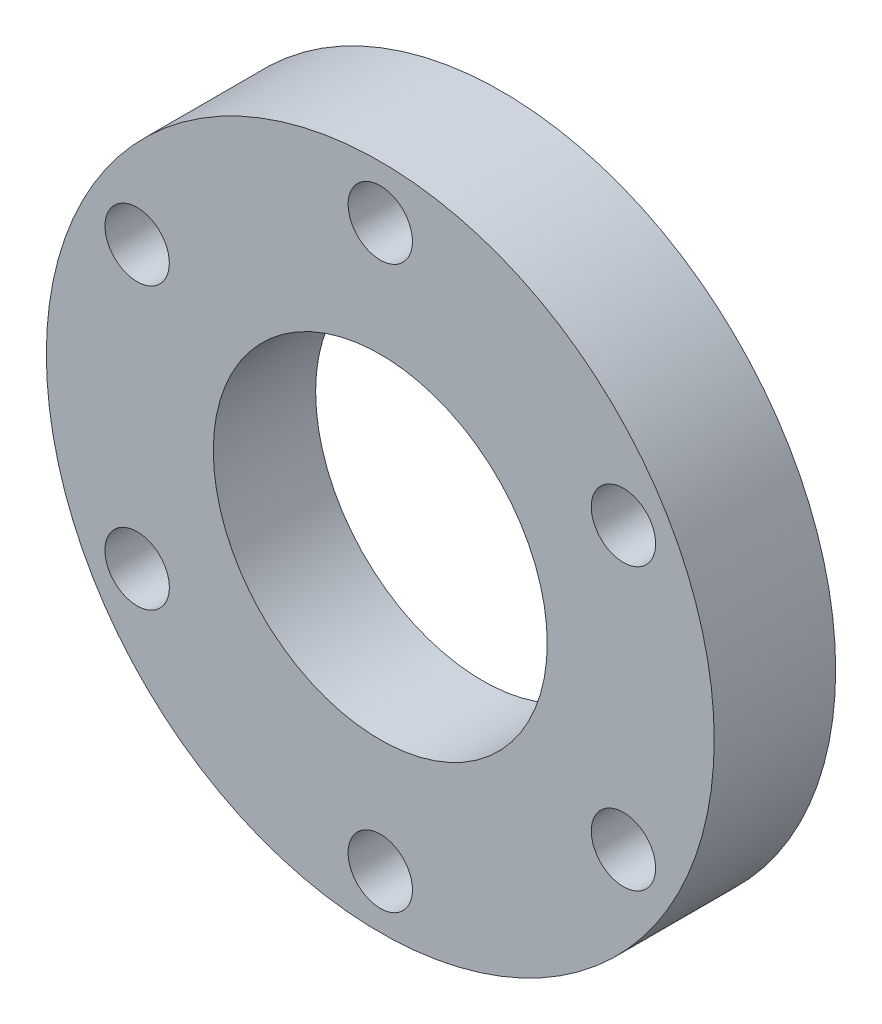
ISO-10303-21;
HEADER;
FILE_DESCRIPTION(('STEP AP214'),'2;1');
FILE_NAME('part.step','',(''),(''),'','','');
FILE_SCHEMA(('AUTOMOTIVE_DESIGN { 1 0 10303 214 1 1 1 1 }'));
ENDSEC;
DATA;
#1=APPLICATION_CONTEXT('core data for automotive mechanical design processes');
#2=APPLICATION_PROTOCOL_DEFINITION('international standard','automotive_design',2000,#1);
#3=PRODUCT_CONTEXT('',#1,'mechanical');
#4=PRODUCT('Part','Part','',(#3));
#5=PRODUCT_RELATED_PRODUCT_CATEGORY('part','',(#4));
#6=PRODUCT_DEFINITION_FORMATION('','',#4);
#7=PRODUCT_DEFINITION_CONTEXT('part definition',#1,'design');
#8=PRODUCT_DEFINITION('design','',#6,#7);
#9=PRODUCT_DEFINITION_SHAPE('','',#8);
#10=(LENGTH_UNIT() NAMED_UNIT(*) SI_UNIT(.MILLI.,.METRE.));
#11=(NAMED_UNIT(*) PLANE_ANGLE_UNIT() SI_UNIT($,.RADIAN.));
#12=(NAMED_UNIT(*) SI_UNIT($,.STERADIAN.) SOLID_ANGLE_UNIT());
#13=UNCERTAINTY_MEASURE_WITH_UNIT(LENGTH_MEASURE(1.E-05),#10,'distance_accuracy_value','');
#14=(GEOMETRIC_REPRESENTATION_CONTEXT(3) GLOBAL_UNCERTAINTY_ASSIGNED_CONTEXT((#13)) GLOBAL_UNIT_ASSIGNED_CONTEXT((#10,
#11,#12)) REPRESENTATION_CONTEXT('',''));
#15=CARTESIAN_POINT('',(0.,0.,0.));
#16=DIRECTION('',(0.,0.,1.));
#17=DIRECTION('',(1.,0.,0.));
#18=AXIS2_PLACEMENT_3D('',#15,#16,#17);
#19=CARTESIAN_POINT('',(0.,0.,12.7));
#20=DIRECTION('',(0.,0.,1.));
#21=DIRECTION('',(1.,0.,0.));
#22=AXIS2_PLACEMENT_3D('',#19,#20,#21);
#23=PLANE('',#22);
#24=CARTESIAN_POINT('',(0.,0.,12.7));
#25=DIRECTION('',(0.,0.,1.));
#26=DIRECTION('',(1.,0.,0.));
#27=AXIS2_PLACEMENT_3D('',#24,#25,#26);
#28=CIRCLE('',#27,17.4625);
#29=CARTESIAN_POINT('',(17.4625,0.,12.7));
#30=VERTEX_POINT('',#29);
#31=EDGE_CURVE('E88',#30,#30,#28,.T.);
#32=ORIENTED_EDGE('',*,*,#31,.F.);
#33=EDGE_LOOP('',(#32));
#34=FACE_BOUND('',#33,.T.);
#35=CARTESIAN_POINT('',(-25.42858431608,14.6812000000003,12.7));
#36=DIRECTION('',(0.,0.,-1.));
#37=DIRECTION('',(-0.50000000000001,-0.866025403784433,0.));
#38=AXIS2_PLACEMENT_3D('',#35,#36,#37);
#39=CIRCLE('',#38,3.3655);
#40=CARTESIAN_POINT('',(-27.1113343160801,11.7665915035638,12.7));
#41=VERTEX_POINT('',#40);
#42=EDGE_CURVE('E76',#41,#41,#39,.T.);
#43=ORIENTED_EDGE('',*,*,#42,.T.);
#44=EDGE_LOOP('',(#43));
#45=FACE_BOUND('',#44,.T.);
#46=CARTESIAN_POINT('',(-25.4285843160803,-14.6811999999998,12.7));
#47=DIRECTION('',(0.,0.,-1.));
#48=DIRECTION('',(0.499999999999992,-0.866025403784443,0.));
#49=AXIS2_PLACEMENT_3D('',#46,#47,#48);
#50=CIRCLE('',#49,3.3655);
#51=CARTESIAN_POINT('',(-23.7458343160804,-17.5958084964363,12.7));
#52=VERTEX_POINT('',#51);
#53=EDGE_CURVE('E70',#52,#52,#50,.T.);
#54=ORIENTED_EDGE('',*,*,#53,.T.);
#55=EDGE_LOOP('',(#54));
#56=FACE_BOUND('',#55,.T.);
#57=CARTESIAN_POINT('',(-2.05036662084476E-13,-29.3624,12.7));
#58=DIRECTION('',(0.,0.,-1.));
#59=DIRECTION('',(1.,0.,0.));
#60=AXIS2_PLACEMENT_3D('',#57,#58,#59);
#61=CIRCLE('',#60,3.3655);
#62=CARTESIAN_POINT('',(3.36549999999979,-29.3624,12.7));
#63=VERTEX_POINT('',#62);
#64=EDGE_CURVE('E64',#63,#63,#61,.T.);
#65=ORIENTED_EDGE('',*,*,#64,.T.);
#66=EDGE_LOOP('',(#65));
#67=FACE_BOUND('',#66,.T.);
#68=CARTESIAN_POINT('',(25.4285843160801,-14.6812000000001,12.7));
#69=DIRECTION('',(0.,0.,-1.));
#70=DIRECTION('',(0.500000000000004,0.866025403784436,0.));
#71=AXIS2_PLACEMENT_3D('',#68,#69,#70);
#72=CIRCLE('',#71,3.3655);
#73=CARTESIAN_POINT('',(27.1113343160802,-11.7665915035636,12.7));
#74=VERTEX_POINT('',#73);
#75=EDGE_CURVE('E58',#74,#74,#72,.T.);
#76=ORIENTED_EDGE('',*,*,#75,.T.);
#77=EDGE_LOOP('',(#76));
#78=FACE_BOUND('',#77,.T.);
#79=CARTESIAN_POINT('',(25.4285843160802,14.6811999999999,12.7));
#80=DIRECTION('',(0.,0.,-1.));
#81=DIRECTION('',(-0.499999999999998,0.86602540378444,0.));
#82=AXIS2_PLACEMENT_3D('',#79,#80,#81);
#83=CIRCLE('',#82,3.3655);
#84=CARTESIAN_POINT('',(23.7458343160802,17.5958084964365,12.7));
#85=VERTEX_POINT('',#84);
#86=EDGE_CURVE('E52',#85,#85,#83,.T.);
#87=ORIENTED_EDGE('',*,*,#86,.T.);
#88=EDGE_LOOP('',(#87));
#89=FACE_BOUND('',#88,.T.);
#90=CARTESIAN_POINT('',(0.,29.3624,12.7));
#91=DIRECTION('',(0.,0.,-1.));
#92=DIRECTION('',(-1.,0.,0.));
#93=AXIS2_PLACEMENT_3D('',#90,#91,#92);
#94=CIRCLE('',#93,3.3655);
#95=CARTESIAN_POINT('',(-3.3655,29.3624,12.7));
#96=VERTEX_POINT('',#95);
#97=EDGE_CURVE('E44',#96,#96,#94,.T.);
#98=ORIENTED_EDGE('',*,*,#97,.T.);
#99=EDGE_LOOP('',(#98));
#100=FACE_BOUND('',#99,.T.);
#101=CARTESIAN_POINT('',(0.,0.,12.7));
#102=DIRECTION('',(0.,0.,1.));
#103=DIRECTION('',(1.,0.,0.));
#104=AXIS2_PLACEMENT_3D('',#101,#102,#103);
#105=CIRCLE('',#104,34.925);
#106=CARTESIAN_POINT('',(34.925,0.,12.7));
#107=VERTEX_POINT('',#106);
#108=EDGE_CURVE('E10',#107,#107,#105,.T.);
#109=ORIENTED_EDGE('',*,*,#108,.T.);
#110=EDGE_LOOP('',(#109));
#111=FACE_BOUND('',#110,.T.);
#112=ADVANCED_FACE('F32',(#34,#45,#56,#67,#78,#89,#100,#111),#23,.T.);
#113=CARTESIAN_POINT('',(0.,0.,0.));
#114=DIRECTION('',(0.,0.,1.));
#115=DIRECTION('',(1.,0.,0.));
#116=AXIS2_PLACEMENT_3D('',#113,#114,#115);
#117=PLANE('',#116);
#118=CARTESIAN_POINT('',(0.,0.,0.));
#119=DIRECTION('',(0.,0.,-1.));
#120=DIRECTION('',(-1.,0.,0.));
#121=AXIS2_PLACEMENT_3D('',#118,#119,#120);
#122=CIRCLE('',#121,23.0712483703385);
#123=CARTESIAN_POINT('',(-23.0712483703385,0.,0.));
#124=VERTEX_POINT('',#123);
#125=EDGE_CURVE('E85',#124,#124,#122,.T.);
#126=ORIENTED_EDGE('',*,*,#125,.F.);
#127=EDGE_LOOP('',(#126));
#128=FACE_BOUND('',#127,.T.);
#129=CARTESIAN_POINT('',(-25.42858431608,14.6812000000003,0.));
#130=DIRECTION('',(0.,0.,-1.));
#131=DIRECTION('',(-0.50000000000001,-0.866025403784433,0.));
#132=AXIS2_PLACEMENT_3D('',#129,#130,#131);
#133=CIRCLE('',#132,3.3655);
#134=CARTESIAN_POINT('',(-27.1113343160801,11.7665915035638,0.));
#135=VERTEX_POINT('',#134);
#136=EDGE_CURVE('E79',#135,#135,#133,.T.);
#137=ORIENTED_EDGE('',*,*,#136,.F.);
#138=EDGE_LOOP('',(#137));
#139=FACE_BOUND('',#138,.T.);
#140=CARTESIAN_POINT('',(-25.4285843160803,-14.6811999999998,0.));
#141=DIRECTION('',(0.,0.,-1.));
#142=DIRECTION('',(0.499999999999992,-0.866025403784443,0.));
#143=AXIS2_PLACEMENT_3D('',#140,#141,#142);
#144=CIRCLE('',#143,3.3655);
#145=CARTESIAN_POINT('',(-23.7458343160804,-17.5958084964363,0.));
#146=VERTEX_POINT('',#145);
#147=EDGE_CURVE('E73',#146,#146,#144,.T.);
#148=ORIENTED_EDGE('',*,*,#147,.F.);
#149=EDGE_LOOP('',(#148));
#150=FACE_BOUND('',#149,.T.);
#151=CARTESIAN_POINT('',(-2.05036662084476E-13,-29.3624,0.));
#152=DIRECTION('',(0.,0.,-1.));
#153=DIRECTION('',(1.,0.,0.));
#154=AXIS2_PLACEMENT_3D('',#151,#152,#153);
#155=CIRCLE('',#154,3.3655);
#156=CARTESIAN_POINT('',(3.36549999999979,-29.3624,0.));
#157=VERTEX_POINT('',#156);
#158=EDGE_CURVE('E67',#157,#157,#155,.T.);
#159=ORIENTED_EDGE('',*,*,#158,.F.);
#160=EDGE_LOOP('',(#159));
#161=FACE_BOUND('',#160,.T.);
#162=CARTESIAN_POINT('',(25.4285843160801,-14.6812000000001,0.));
#163=DIRECTION('',(0.,0.,-1.));
#164=DIRECTION('',(0.500000000000004,0.866025403784436,0.));
#165=AXIS2_PLACEMENT_3D('',#162,#163,#164);
#166=CIRCLE('',#165,3.3655);
#167=CARTESIAN_POINT('',(27.1113343160802,-11.7665915035636,0.));
#168=VERTEX_POINT('',#167);
#169=EDGE_CURVE('E61',#168,#168,#166,.T.);
#170=ORIENTED_EDGE('',*,*,#169,.F.);
#171=EDGE_LOOP('',(#170));
#172=FACE_BOUND('',#171,.T.);
#173=CARTESIAN_POINT('',(25.4285843160802,14.6811999999999,0.));
#174=DIRECTION('',(0.,0.,-1.));
#175=DIRECTION('',(-0.499999999999998,0.86602540378444,0.));
#176=AXIS2_PLACEMENT_3D('',#173,#174,#175);
#177=CIRCLE('',#176,3.3655);
#178=CARTESIAN_POINT('',(23.7458343160802,17.5958084964365,0.));
#179=VERTEX_POINT('',#178);
#180=EDGE_CURVE('E55',#179,#179,#177,.T.);
#181=ORIENTED_EDGE('',*,*,#180,.F.);
#182=EDGE_LOOP('',(#181));
#183=FACE_BOUND('',#182,.T.);
#184=CARTESIAN_POINT('',(0.,29.3624,0.));
#185=DIRECTION('',(0.,0.,-1.));
#186=DIRECTION('',(-1.,0.,0.));
#187=AXIS2_PLACEMENT_3D('',#184,#185,#186);
#188=CIRCLE('',#187,3.3655);
#189=CARTESIAN_POINT('',(-3.3655,29.3624,0.));
#190=VERTEX_POINT('',#189);
#191=EDGE_CURVE('E49',#190,#190,#188,.T.);
#192=ORIENTED_EDGE('',*,*,#191,.F.);
#193=EDGE_LOOP('',(#192));
#194=FACE_BOUND('',#193,.T.);
#195=CARTESIAN_POINT('',(0.,0.,0.));
#196=DIRECTION('',(0.,0.,1.));
#197=DIRECTION('',(1.,0.,0.));
#198=AXIS2_PLACEMENT_3D('',#195,#196,#197);
#199=CIRCLE('',#198,34.925);
#200=CARTESIAN_POINT('',(34.925,0.,0.));
#201=VERTEX_POINT('',#200);
#202=EDGE_CURVE('E40',#201,#201,#199,.T.);
#203=ORIENTED_EDGE('',*,*,#202,.F.);
#204=EDGE_LOOP('',(#203));
#205=FACE_BOUND('',#204,.T.);
#206=ADVANCED_FACE('F110',(#128,#139,#150,#161,#172,#183,#194,#205),#117,.F.);
#207=CARTESIAN_POINT('',(0.,0.,12.7));
#208=DIRECTION('',(0.,0.,-1.));
#209=DIRECTION('',(-1.,0.,0.));
#210=AXIS2_PLACEMENT_3D('',#207,#208,#209);
#211=CYLINDRICAL_SURFACE('',#210,34.925);
#212=ORIENTED_EDGE('',*,*,#108,.F.);
#213=EDGE_LOOP('',(#212));
#214=FACE_BOUND('',#213,.T.);
#215=ORIENTED_EDGE('',*,*,#202,.T.);
#216=EDGE_LOOP('',(#215));
#217=FACE_BOUND('',#216,.T.);
#218=ADVANCED_FACE('F34',(#214,#217),#211,.T.);
#219=CARTESIAN_POINT('',(0.,29.3624,12.7));
#220=DIRECTION('',(0.,0.,-1.));
#221=DIRECTION('',(-1.,0.,0.));
#222=AXIS2_PLACEMENT_3D('',#219,#220,#221);
#223=CYLINDRICAL_SURFACE('',#222,3.3655);
#224=ORIENTED_EDGE('',*,*,#97,.F.);
#225=EDGE_LOOP('',(#224));
#226=FACE_BOUND('',#225,.T.);
#227=ORIENTED_EDGE('',*,*,#191,.T.);
#228=EDGE_LOOP('',(#227));
#229=FACE_BOUND('',#228,.T.);
#230=ADVANCED_FACE('F129',(#226,#229),#223,.F.);
#231=CARTESIAN_POINT('',(25.4285843160802,14.6811999999999,12.7));
#232=DIRECTION('',(0.,0.,-1.));
#233=DIRECTION('',(-1.,0.,0.));
#234=AXIS2_PLACEMENT_3D('',#231,#232,#233);
#235=CYLINDRICAL_SURFACE('',#234,3.3655);
#236=ORIENTED_EDGE('',*,*,#86,.F.);
#237=EDGE_LOOP('',(#236));
#238=FACE_BOUND('',#237,.T.);
#239=ORIENTED_EDGE('',*,*,#180,.T.);
#240=EDGE_LOOP('',(#239));
#241=FACE_BOUND('',#240,.T.);
#242=ADVANCED_FACE('F134',(#238,#241),#235,.F.);
#243=CARTESIAN_POINT('',(25.4285843160801,-14.6812000000001,12.7));
#244=DIRECTION('',(0.,0.,-1.));
#245=DIRECTION('',(-1.,0.,0.));
#246=AXIS2_PLACEMENT_3D('',#243,#244,#245);
#247=CYLINDRICAL_SURFACE('',#246,3.3655);
#248=ORIENTED_EDGE('',*,*,#75,.F.);
#249=EDGE_LOOP('',(#248));
#250=FACE_BOUND('',#249,.T.);
#251=ORIENTED_EDGE('',*,*,#169,.T.);
#252=EDGE_LOOP('',(#251));
#253=FACE_BOUND('',#252,.T.);
#254=ADVANCED_FACE('F145',(#250,#253),#247,.F.);
#255=CARTESIAN_POINT('',(-2.05036662084476E-13,-29.3624,12.7));
#256=DIRECTION('',(0.,0.,-1.));
#257=DIRECTION('',(-1.,0.,0.));
#258=AXIS2_PLACEMENT_3D('',#255,#256,#257);
#259=CYLINDRICAL_SURFACE('',#258,3.3655);
#260=ORIENTED_EDGE('',*,*,#64,.F.);
#261=EDGE_LOOP('',(#260));
#262=FACE_BOUND('',#261,.T.);
#263=ORIENTED_EDGE('',*,*,#158,.T.);
#264=EDGE_LOOP('',(#263));
#265=FACE_BOUND('',#264,.T.);
#266=ADVANCED_FACE('F149',(#262,#265),#259,.F.);
#267=CARTESIAN_POINT('',(-25.4285843160803,-14.6811999999998,12.7));
#268=DIRECTION('',(0.,0.,-1.));
#269=DIRECTION('',(-1.,0.,0.));
#270=AXIS2_PLACEMENT_3D('',#267,#268,#269);
#271=CYLINDRICAL_SURFACE('',#270,3.3655);
#272=ORIENTED_EDGE('',*,*,#53,.F.);
#273=EDGE_LOOP('',(#272));
#274=FACE_BOUND('',#273,.T.);
#275=ORIENTED_EDGE('',*,*,#147,.T.);
#276=EDGE_LOOP('',(#275));
#277=FACE_BOUND('',#276,.T.);
#278=ADVANCED_FACE('F153',(#274,#277),#271,.F.);
#279=CARTESIAN_POINT('',(-25.42858431608,14.6812000000003,12.7));
#280=DIRECTION('',(0.,0.,-1.));
#281=DIRECTION('',(-1.,0.,0.));
#282=AXIS2_PLACEMENT_3D('',#279,#280,#281);
#283=CYLINDRICAL_SURFACE('',#282,3.3655);
#284=ORIENTED_EDGE('',*,*,#42,.F.);
#285=EDGE_LOOP('',(#284));
#286=FACE_BOUND('',#285,.T.);
#287=ORIENTED_EDGE('',*,*,#136,.T.);
#288=EDGE_LOOP('',(#287));
#289=FACE_BOUND('',#288,.T.);
#290=ADVANCED_FACE('F106',(#286,#289),#283,.F.);
#291=CARTESIAN_POINT('',(0.,0.,2.));
#292=DIRECTION('',(0.,0.,-1.));
#293=DIRECTION('',(-1.,0.,0.));
#294=AXIS2_PLACEMENT_3D('',#291,#292,#293);
#295=CYLINDRICAL_SURFACE('',#294,23.0712483703385);
#296=CARTESIAN_POINT('',(0.,0.,2.));
#297=DIRECTION('',(0.,0.,-1.));
#298=DIRECTION('',(-1.,0.,0.));
#299=AXIS2_PLACEMENT_3D('',#296,#297,#298);
#300=CIRCLE('',#299,23.0712483703385);
#301=CARTESIAN_POINT('',(-23.0712483703385,0.,2.));
#302=VERTEX_POINT('',#301);
#303=EDGE_CURVE('E82',#302,#302,#300,.T.);
#304=ORIENTED_EDGE('',*,*,#303,.F.);
#305=EDGE_LOOP('',(#304));
#306=FACE_BOUND('',#305,.T.);
#307=ORIENTED_EDGE('',*,*,#125,.T.);
#308=EDGE_LOOP('',(#307));
#309=FACE_BOUND('',#308,.T.);
#310=ADVANCED_FACE('F100',(#306,#309),#295,.F.);
#311=CARTESIAN_POINT('',(0.,0.,2.));
#312=DIRECTION('',(0.,0.,-1.));
#313=DIRECTION('',(-1.,0.,0.));
#314=AXIS2_PLACEMENT_3D('',#311,#312,#313);
#315=PLANE('',#314);
#316=CARTESIAN_POINT('',(0.,0.,2.));
#317=DIRECTION('',(0.,0.,-1.));
#318=DIRECTION('',(-1.,0.,0.));
#319=AXIS2_PLACEMENT_3D('',#316,#317,#318);
#320=CIRCLE('',#319,17.4625);
#321=CARTESIAN_POINT('',(-17.4625,0.,2.));
#322=VERTEX_POINT('',#321);
#323=EDGE_CURVE('E36',#322,#322,#320,.T.);
#324=ORIENTED_EDGE('',*,*,#323,.F.);
#325=EDGE_LOOP('',(#324));
#326=FACE_BOUND('',#325,.T.);
#327=ORIENTED_EDGE('',*,*,#303,.T.);
#328=EDGE_LOOP('',(#327));
#329=FACE_BOUND('',#328,.T.);
#330=ADVANCED_FACE('F97',(#326,#329),#315,.T.);
#331=CARTESIAN_POINT('',(0.,0.,0.));
#332=DIRECTION('',(0.,0.,1.));
#333=DIRECTION('',(1.,0.,0.));
#334=AXIS2_PLACEMENT_3D('',#331,#332,#333);
#335=CYLINDRICAL_SURFACE('',#334,17.4625);
#336=ORIENTED_EDGE('',*,*,#323,.T.);
#337=EDGE_LOOP('',(#336));
#338=FACE_BOUND('',#337,.T.);
#339=ORIENTED_EDGE('',*,*,#31,.T.);
#340=EDGE_LOOP('',(#339));
#341=FACE_BOUND('',#340,.T.);
#342=ADVANCED_FACE('F95',(#338,#341),#335,.F.);
#343=CLOSED_SHELL('',(#112,#206,#218,#230,#242,#254,#266,#278,#290,#310,#330,#342));
#344=MANIFOLD_SOLID_BREP('B2',#343);
#345=ADVANCED_BREP_SHAPE_REPRESENTATION('',(#18,#344),#14);
#346=SHAPE_DEFINITION_REPRESENTATION(#9,#345);
ENDSEC;
END-ISO-10303-21;
